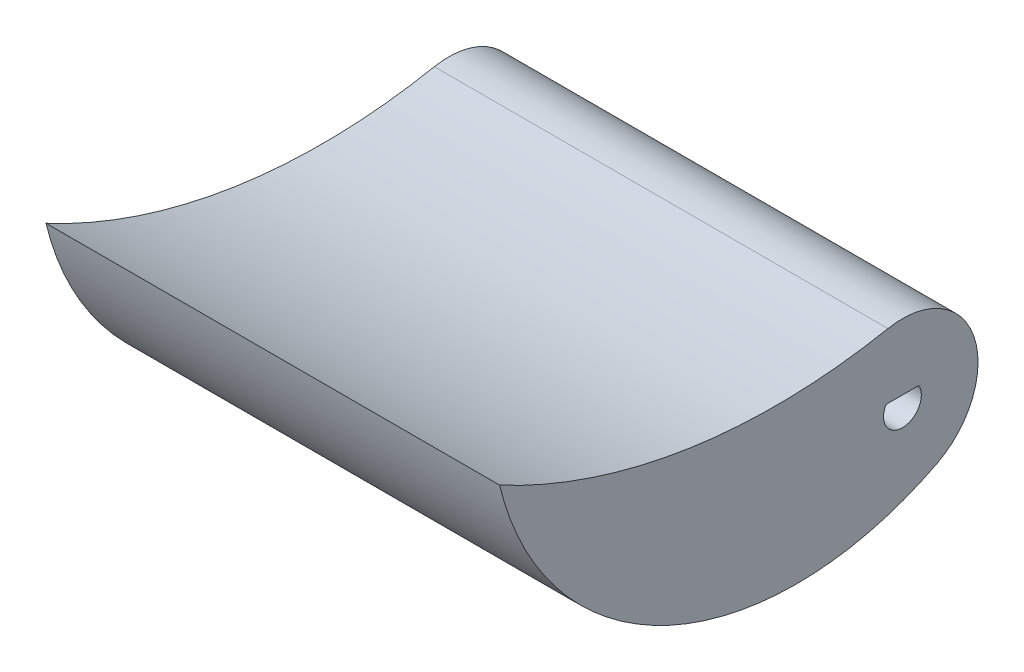
ISO-10303-21;
HEADER;
FILE_DESCRIPTION(('STEP AP214'),'2;1');
FILE_NAME('part.step','',(''),(''),'','','');
FILE_SCHEMA(('AUTOMOTIVE_DESIGN { 1 0 10303 214 1 1 1 1 }'));
ENDSEC;
DATA;
#1=APPLICATION_CONTEXT('core data for automotive mechanical design processes');
#2=APPLICATION_PROTOCOL_DEFINITION('international standard','automotive_design',2000,#1);
#3=PRODUCT_CONTEXT('',#1,'mechanical');
#4=PRODUCT('Part','Part','',(#3));
#5=PRODUCT_RELATED_PRODUCT_CATEGORY('part','',(#4));
#6=PRODUCT_DEFINITION_FORMATION('','',#4);
#7=PRODUCT_DEFINITION_CONTEXT('part definition',#1,'design');
#8=PRODUCT_DEFINITION('design','',#6,#7);
#9=PRODUCT_DEFINITION_SHAPE('','',#8);
#10=(LENGTH_UNIT() NAMED_UNIT(*) SI_UNIT(.MILLI.,.METRE.));
#11=(NAMED_UNIT(*) PLANE_ANGLE_UNIT() SI_UNIT($,.RADIAN.));
#12=(NAMED_UNIT(*) SI_UNIT($,.STERADIAN.) SOLID_ANGLE_UNIT());
#13=UNCERTAINTY_MEASURE_WITH_UNIT(LENGTH_MEASURE(1.E-05),#10,'distance_accuracy_value','');
#14=(GEOMETRIC_REPRESENTATION_CONTEXT(3) GLOBAL_UNCERTAINTY_ASSIGNED_CONTEXT((#13)) GLOBAL_UNIT_ASSIGNED_CONTEXT((#10,
#11,#12)) REPRESENTATION_CONTEXT('',''));
#15=CARTESIAN_POINT('',(0.,0.,0.));
#16=DIRECTION('',(0.,0.,1.));
#17=DIRECTION('',(1.,0.,0.));
#18=AXIS2_PLACEMENT_3D('',#15,#16,#17);
#19=CARTESIAN_POINT('',(76.2,109.028762658931,21.2180776391853));
#20=DIRECTION('',(1.,0.,0.));
#21=DIRECTION('',(0.,0.,-1.));
#22=AXIS2_PLACEMENT_3D('',#19,#20,#21);
#23=PLANE('',#22);
#24=CARTESIAN_POINT('',(76.2,218.057525317862,42.4361552783706));
#25=DIRECTION('',(-1.,0.,0.));
#26=DIRECTION('',(0.,0.,-1.));
#27=AXIS2_PLACEMENT_3D('',#24,#25,#26);
#28=CIRCLE('',#27,196.7484);
#29=CARTESIAN_POINT('',(76.2,24.9322576398196,4.85206440411281));
#30=VERTEX_POINT('',#29);
#31=CARTESIAN_POINT('',(76.2,44.6313382021616,135.351657349177));
#32=VERTEX_POINT('',#31);
#33=EDGE_CURVE('E95',#30,#32,#28,.T.);
#34=ORIENTED_EDGE('',*,*,#33,.T.);
#35=CARTESIAN_POINT('',(76.2,68.6829089968322,35.4948413221311));
#36=DIRECTION('',(1.,0.,0.));
#37=DIRECTION('',(0.,0.,1.));
#38=AXIS2_PLACEMENT_3D('',#35,#36,#37);
#39=CIRCLE('',#38,102.71252);
#40=CARTESIAN_POINT('',(76.2,-22.5648560998857,-11.6613579480029));
#41=VERTEX_POINT('',#40);
#42=EDGE_CURVE('E98',#32,#41,#39,.T.);
#43=ORIENTED_EDGE('',*,*,#42,.T.);
#44=CARTESIAN_POINT('',(76.2,0.,0.));
#45=DIRECTION('',(1.,0.,0.));
#46=DIRECTION('',(0.,0.,1.));
#47=AXIS2_PLACEMENT_3D('',#44,#45,#46);
#48=CIRCLE('',#47,25.4);
#49=EDGE_CURVE('E101',#41,#30,#48,.T.);
#50=ORIENTED_EDGE('',*,*,#49,.T.);
#51=EDGE_LOOP('',(#34,#43,#50));
#52=FACE_BOUND('',#51,.T.);
#53=DIRECTION('',(0.,0.,1.));
#54=VECTOR('',#53,1.);
#55=CARTESIAN_POINT('',(76.2,3.17527938770748,5.4991));
#56=LINE('',#55,#54);
#57=CARTESIAN_POINT('',(76.2,3.17527938770748,-5.4991));
#58=VERTEX_POINT('',#57);
#59=CARTESIAN_POINT('',(76.2,3.17527938770748,5.4991));
#60=VERTEX_POINT('',#59);
#61=EDGE_CURVE('E78',#58,#60,#56,.T.);
#62=ORIENTED_EDGE('',*,*,#61,.F.);
#63=CARTESIAN_POINT('',(76.2,0.,0.));
#64=DIRECTION('',(1.,0.,0.));
#65=DIRECTION('',(0.,0.,-1.));
#66=AXIS2_PLACEMENT_3D('',#63,#64,#65);
#67=CIRCLE('',#66,6.35);
#68=EDGE_CURVE('E84',#60,#58,#67,.T.);
#69=ORIENTED_EDGE('',*,*,#68,.F.);
#70=EDGE_LOOP('',(#62,#69));
#71=FACE_BOUND('',#70,.T.);
#72=ADVANCED_FACE('F32',(#52,#71),#23,.T.);
#73=CARTESIAN_POINT('',(-76.2,109.028762658931,21.2180776391853));
#74=DIRECTION('',(1.,0.,0.));
#75=DIRECTION('',(0.,0.,-1.));
#76=AXIS2_PLACEMENT_3D('',#73,#74,#75);
#77=PLANE('',#76);
#78=CARTESIAN_POINT('',(-76.2,218.057525317862,42.4361552783706));
#79=DIRECTION('',(-1.,0.,0.));
#80=DIRECTION('',(0.,0.,-1.));
#81=AXIS2_PLACEMENT_3D('',#78,#79,#80);
#82=CIRCLE('',#81,196.7484);
#83=CARTESIAN_POINT('',(-76.2,24.9322576398196,4.85206440411281));
#84=VERTEX_POINT('',#83);
#85=CARTESIAN_POINT('',(-76.2,44.6313382021616,135.351657349177));
#86=VERTEX_POINT('',#85);
#87=EDGE_CURVE('E94',#84,#86,#82,.T.);
#88=ORIENTED_EDGE('',*,*,#87,.F.);
#89=CARTESIAN_POINT('',(-76.2,0.,0.));
#90=DIRECTION('',(1.,0.,0.));
#91=DIRECTION('',(0.,0.,1.));
#92=AXIS2_PLACEMENT_3D('',#89,#90,#91);
#93=CIRCLE('',#92,25.4);
#94=CARTESIAN_POINT('',(-76.2,-22.5648560998857,-11.6613579480029));
#95=VERTEX_POINT('',#94);
#96=EDGE_CURVE('E99',#95,#84,#93,.T.);
#97=ORIENTED_EDGE('',*,*,#96,.F.);
#98=CARTESIAN_POINT('',(-76.2,68.6829089968322,35.4948413221311));
#99=DIRECTION('',(1.,0.,0.));
#100=DIRECTION('',(0.,0.,1.));
#101=AXIS2_PLACEMENT_3D('',#98,#99,#100);
#102=CIRCLE('',#101,102.71252);
#103=EDGE_CURVE('E106',#86,#95,#102,.T.);
#104=ORIENTED_EDGE('',*,*,#103,.F.);
#105=EDGE_LOOP('',(#88,#97,#104));
#106=FACE_BOUND('',#105,.T.);
#107=CARTESIAN_POINT('',(-76.2,0.,0.));
#108=DIRECTION('',(1.,0.,0.));
#109=DIRECTION('',(0.,0.,-1.));
#110=AXIS2_PLACEMENT_3D('',#107,#108,#109);
#111=CIRCLE('',#110,6.35);
#112=CARTESIAN_POINT('',(-76.2,3.17527938770748,5.4991));
#113=VERTEX_POINT('',#112);
#114=CARTESIAN_POINT('',(-76.2,3.17527938770748,-5.4991));
#115=VERTEX_POINT('',#114);
#116=EDGE_CURVE('E54',#113,#115,#111,.T.);
#117=ORIENTED_EDGE('',*,*,#116,.T.);
#118=DIRECTION('',(0.,0.,1.));
#119=VECTOR('',#118,1.);
#120=CARTESIAN_POINT('',(-76.2,3.17527938770748,5.4991));
#121=LINE('',#120,#119);
#122=EDGE_CURVE('E88',#115,#113,#121,.T.);
#123=ORIENTED_EDGE('',*,*,#122,.T.);
#124=EDGE_LOOP('',(#117,#123));
#125=FACE_BOUND('',#124,.T.);
#126=ADVANCED_FACE('F120',(#106,#125),#77,.F.);
#127=CARTESIAN_POINT('',(76.2,218.057525317862,42.4361552783706));
#128=DIRECTION('',(-1.,0.,0.));
#129=DIRECTION('',(0.,0.,1.));
#130=AXIS2_PLACEMENT_3D('',#127,#128,#129);
#131=CYLINDRICAL_SURFACE('',#130,196.7484);
#132=ORIENTED_EDGE('',*,*,#87,.T.);
#133=DIRECTION('',(-1.,0.,0.));
#134=VECTOR('',#133,1.);
#135=CARTESIAN_POINT('',(76.2,44.6313382021616,135.351657349177));
#136=LINE('',#135,#134);
#137=EDGE_CURVE('E11',#32,#86,#136,.T.);
#138=ORIENTED_EDGE('',*,*,#137,.F.);
#139=ORIENTED_EDGE('',*,*,#33,.F.);
#140=DIRECTION('',(-1.,0.,0.));
#141=VECTOR('',#140,1.);
#142=CARTESIAN_POINT('',(76.2,24.9322576398196,4.85206440411281));
#143=LINE('',#142,#141);
#144=EDGE_CURVE('E103',#30,#84,#143,.T.);
#145=ORIENTED_EDGE('',*,*,#144,.T.);
#146=EDGE_LOOP('',(#132,#138,#139,#145));
#147=FACE_BOUND('',#146,.T.);
#148=ADVANCED_FACE('F34',(#147),#131,.F.);
#149=CARTESIAN_POINT('',(76.2,68.6829089968322,35.4948413221311));
#150=DIRECTION('',(-1.,0.,0.));
#151=DIRECTION('',(0.,0.,1.));
#152=AXIS2_PLACEMENT_3D('',#149,#150,#151);
#153=CYLINDRICAL_SURFACE('',#152,102.71252);
#154=ORIENTED_EDGE('',*,*,#103,.T.);
#155=DIRECTION('',(-1.,0.,0.));
#156=VECTOR('',#155,1.);
#157=CARTESIAN_POINT('',(76.2,-22.5648560998857,-11.6613579480029));
#158=LINE('',#157,#156);
#159=EDGE_CURVE('E40',#41,#95,#158,.T.);
#160=ORIENTED_EDGE('',*,*,#159,.F.);
#161=ORIENTED_EDGE('',*,*,#42,.F.);
#162=ORIENTED_EDGE('',*,*,#137,.T.);
#163=EDGE_LOOP('',(#154,#160,#161,#162));
#164=FACE_BOUND('',#163,.T.);
#165=ADVANCED_FACE('F126',(#164),#153,.T.);
#166=CARTESIAN_POINT('',(76.2,0.,0.));
#167=DIRECTION('',(-1.,0.,0.));
#168=DIRECTION('',(0.,0.,1.));
#169=AXIS2_PLACEMENT_3D('',#166,#167,#168);
#170=CYLINDRICAL_SURFACE('',#169,25.4);
#171=ORIENTED_EDGE('',*,*,#96,.T.);
#172=ORIENTED_EDGE('',*,*,#144,.F.);
#173=ORIENTED_EDGE('',*,*,#49,.F.);
#174=ORIENTED_EDGE('',*,*,#159,.T.);
#175=EDGE_LOOP('',(#171,#172,#173,#174));
#176=FACE_BOUND('',#175,.T.);
#177=ADVANCED_FACE('F115',(#176),#170,.T.);
#178=CARTESIAN_POINT('',(76.2,0.,0.));
#179=DIRECTION('',(-1.,0.,0.));
#180=DIRECTION('',(0.,0.,1.));
#181=AXIS2_PLACEMENT_3D('',#178,#179,#180);
#182=CYLINDRICAL_SURFACE('',#181,6.35);
#183=ORIENTED_EDGE('',*,*,#116,.F.);
#184=DIRECTION('',(-1.,0.,0.));
#185=VECTOR('',#184,1.);
#186=CARTESIAN_POINT('',(76.2,3.17527938770748,5.4991));
#187=LINE('',#186,#185);
#188=EDGE_CURVE('E80',#60,#113,#187,.T.);
#189=ORIENTED_EDGE('',*,*,#188,.F.);
#190=ORIENTED_EDGE('',*,*,#68,.T.);
#191=DIRECTION('',(-1.,0.,0.));
#192=VECTOR('',#191,1.);
#193=CARTESIAN_POINT('',(76.2,3.17527938770748,-5.4991));
#194=LINE('',#193,#192);
#195=EDGE_CURVE('E47',#58,#115,#194,.T.);
#196=ORIENTED_EDGE('',*,*,#195,.T.);
#197=EDGE_LOOP('',(#183,#189,#190,#196));
#198=FACE_BOUND('',#197,.T.);
#199=ADVANCED_FACE('F86',(#198),#182,.F.);
#200=CARTESIAN_POINT('',(76.2,3.17527938770748,5.4991));
#201=DIRECTION('',(0.,-1.,0.));
#202=DIRECTION('',(0.,0.,-1.));
#203=AXIS2_PLACEMENT_3D('',#200,#201,#202);
#204=PLANE('',#203);
#205=ORIENTED_EDGE('',*,*,#122,.F.);
#206=ORIENTED_EDGE('',*,*,#195,.F.);
#207=ORIENTED_EDGE('',*,*,#61,.T.);
#208=ORIENTED_EDGE('',*,*,#188,.T.);
#209=EDGE_LOOP('',(#205,#206,#207,#208));
#210=FACE_BOUND('',#209,.T.);
#211=ADVANCED_FACE('F79',(#210),#204,.T.);
#212=CLOSED_SHELL('',(#72,#126,#148,#165,#177,#199,#211));
#213=MANIFOLD_SOLID_BREP('B2',#212);
#214=ADVANCED_BREP_SHAPE_REPRESENTATION('',(#18,#213),#14);
#215=SHAPE_DEFINITION_REPRESENTATION(#9,#214);
ENDSEC;
END-ISO-10303-21;
